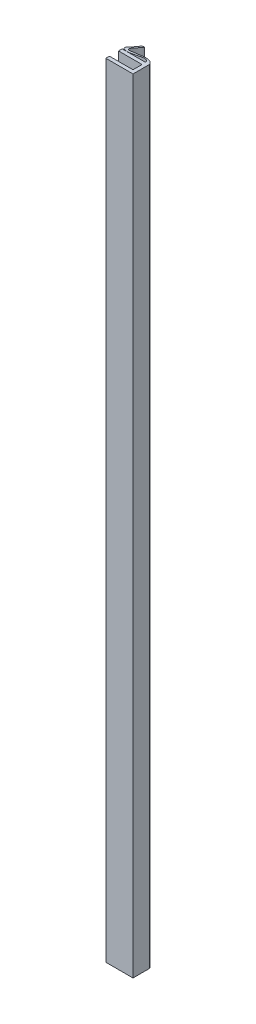
ISO-10303-21;
HEADER;
FILE_DESCRIPTION(('STEP AP214'),'2;1');
FILE_NAME('part.step','',(''),(''),'','','');
FILE_SCHEMA(('AUTOMOTIVE_DESIGN { 1 0 10303 214 1 1 1 1 }'));
ENDSEC;
DATA;
#1=APPLICATION_CONTEXT('core data for automotive mechanical design processes');
#2=APPLICATION_PROTOCOL_DEFINITION('international standard','automotive_design',2000,#1);
#3=PRODUCT_CONTEXT('',#1,'mechanical');
#4=PRODUCT('Part','Part','',(#3));
#5=PRODUCT_RELATED_PRODUCT_CATEGORY('part','',(#4));
#6=PRODUCT_DEFINITION_FORMATION('','',#4);
#7=PRODUCT_DEFINITION_CONTEXT('part definition',#1,'design');
#8=PRODUCT_DEFINITION('design','',#6,#7);
#9=PRODUCT_DEFINITION_SHAPE('','',#8);
#10=(LENGTH_UNIT() NAMED_UNIT(*) SI_UNIT(.MILLI.,.METRE.));
#11=(NAMED_UNIT(*) PLANE_ANGLE_UNIT() SI_UNIT($,.RADIAN.));
#12=(NAMED_UNIT(*) SI_UNIT($,.STERADIAN.) SOLID_ANGLE_UNIT());
#13=UNCERTAINTY_MEASURE_WITH_UNIT(LENGTH_MEASURE(1.E-05),#10,'distance_accuracy_value','');
#14=(GEOMETRIC_REPRESENTATION_CONTEXT(3) GLOBAL_UNCERTAINTY_ASSIGNED_CONTEXT((#13)) GLOBAL_UNIT_ASSIGNED_CONTEXT((#10,
#11,#12)) REPRESENTATION_CONTEXT('',''));
#15=CARTESIAN_POINT('',(0.,0.,0.));
#16=DIRECTION('',(0.,0.,1.));
#17=DIRECTION('',(1.,0.,0.));
#18=AXIS2_PLACEMENT_3D('',#15,#16,#17);
#19=CARTESIAN_POINT('',(-138.333333333333,81.4583333333333,9.));
#20=DIRECTION('',(1.,0.,0.));
#21=DIRECTION('',(0.,1.,0.));
#22=AXIS2_PLACEMENT_3D('',#19,#20,#21);
#23=PLANE('',#22);
#24=DIRECTION('',(0.,0.,-1.));
#25=VECTOR('',#24,1.);
#26=CARTESIAN_POINT('',(-138.333333333333,-350.541666666667,9.));
#27=LINE('',#26,#25);
#28=CARTESIAN_POINT('',(-138.333333333333,-350.541666666667,2.00000000000005));
#29=VERTEX_POINT('',#28);
#30=CARTESIAN_POINT('',(-138.333333333333,-350.541666666667,0.));
#31=VERTEX_POINT('',#30);
#32=EDGE_CURVE('E41',#29,#31,#27,.T.);
#33=ORIENTED_EDGE('',*,*,#32,.F.);
#34=DIRECTION('',(0.,-1.,0.));
#35=VECTOR('',#34,1.);
#36=CARTESIAN_POINT('',(-138.333333333333,81.4583333333333,2.));
#37=LINE('',#36,#35);
#38=CARTESIAN_POINT('',(-138.333333333333,81.4583333333333,2.));
#39=VERTEX_POINT('',#38);
#40=EDGE_CURVE('E180',#39,#29,#37,.T.);
#41=ORIENTED_EDGE('',*,*,#40,.F.);
#42=DIRECTION('',(0.,0.,-1.));
#43=VECTOR('',#42,1.);
#44=CARTESIAN_POINT('',(-138.333333333333,81.4583333333333,9.));
#45=LINE('',#44,#43);
#46=CARTESIAN_POINT('',(-138.333333333333,81.4583333333333,0.));
#47=VERTEX_POINT('',#46);
#48=EDGE_CURVE('E151',#39,#47,#45,.T.);
#49=ORIENTED_EDGE('',*,*,#48,.T.);
#50=DIRECTION('',(0.,-1.,0.));
#51=VECTOR('',#50,1.);
#52=CARTESIAN_POINT('',(-138.333333333333,81.4583333333333,0.));
#53=LINE('',#52,#51);
#54=EDGE_CURVE('E156',#47,#31,#53,.T.);
#55=ORIENTED_EDGE('',*,*,#54,.T.);
#56=EDGE_LOOP('',(#33,#41,#49,#55));
#57=FACE_BOUND('',#56,.T.);
#58=ADVANCED_FACE('F33',(#57),#23,.F.);
#59=CARTESIAN_POINT('',(-138.333333333333,81.4583333333333,9.));
#60=VERTEX_POINT('',#59);
#61=CARTESIAN_POINT('',(-138.333333333333,81.4583333333333,7.));
#62=VERTEX_POINT('',#61);
#63=EDGE_CURVE('E146',#60,#62,#45,.T.);
#64=ORIENTED_EDGE('',*,*,#63,.T.);
#65=DIRECTION('',(0.,1.,0.));
#66=VECTOR('',#65,1.);
#67=CARTESIAN_POINT('',(-138.333333333333,81.4583333333333,7.));
#68=LINE('',#67,#66);
#69=CARTESIAN_POINT('',(-138.333333333333,-350.541666666667,7.00000000000005));
#70=VERTEX_POINT('',#69);
#71=EDGE_CURVE('E177',#70,#62,#68,.T.);
#72=ORIENTED_EDGE('',*,*,#71,.F.);
#73=CARTESIAN_POINT('',(-138.333333333333,-350.541666666667,9.));
#74=VERTEX_POINT('',#73);
#75=EDGE_CURVE('E11',#74,#70,#27,.T.);
#76=ORIENTED_EDGE('',*,*,#75,.F.);
#77=DIRECTION('',(0.,-1.,0.));
#78=VECTOR('',#77,1.);
#79=CARTESIAN_POINT('',(-138.333333333333,81.4583333333333,9.));
#80=LINE('',#79,#78);
#81=EDGE_CURVE('E152',#60,#74,#80,.T.);
#82=ORIENTED_EDGE('',*,*,#81,.F.);
#83=EDGE_LOOP('',(#64,#72,#76,#82));
#84=FACE_BOUND('',#83,.T.);
#85=ADVANCED_FACE('F35',(#84),#23,.F.);
#86=CARTESIAN_POINT('',(-138.333333333333,-350.541666666667,9.));
#87=DIRECTION('',(0.,1.,0.));
#88=DIRECTION('',(0.,0.,1.));
#89=AXIS2_PLACEMENT_3D('',#86,#87,#88);
#90=PLANE('',#89);
#91=DIRECTION('',(0.,0.,1.));
#92=VECTOR('',#91,1.);
#93=CARTESIAN_POINT('',(-125.333333333333,-350.541666666667,2.00000000000005));
#94=LINE('',#93,#92);
#95=CARTESIAN_POINT('',(-125.333333333333,-350.541666666667,2.00000000000005));
#96=VERTEX_POINT('',#95);
#97=CARTESIAN_POINT('',(-125.333333333333,-350.541666666667,7.00000000000005));
#98=VERTEX_POINT('',#97);
#99=EDGE_CURVE('E184',#96,#98,#94,.T.);
#100=ORIENTED_EDGE('',*,*,#99,.F.);
#101=DIRECTION('',(-1.,0.,0.));
#102=VECTOR('',#101,1.);
#103=CARTESIAN_POINT('',(-125.333333333333,-350.541666666667,2.00000000000005));
#104=LINE('',#103,#102);
#105=EDGE_CURVE('E167',#96,#29,#104,.T.);
#106=ORIENTED_EDGE('',*,*,#105,.T.);
#107=ORIENTED_EDGE('',*,*,#32,.T.);
#108=DIRECTION('',(1.,0.,0.));
#109=VECTOR('',#108,1.);
#110=CARTESIAN_POINT('',(-138.333333333333,-350.541666666667,0.));
#111=LINE('',#110,#109);
#112=CARTESIAN_POINT('',(-125.536673175502,-350.541666666667,0.));
#113=VERTEX_POINT('',#112);
#114=EDGE_CURVE('E130',#31,#113,#111,.T.);
#115=ORIENTED_EDGE('',*,*,#114,.T.);
#116=CARTESIAN_POINT('',(-125.536673175502,-350.541666666667,0.));
#117=CARTESIAN_POINT('',(-125.569623367716,-350.541666666667,-2.13980410945582));
#118=CARTESIAN_POINT('',(-131.4288623102,-350.541666666667,-1.1507862053045));
#119=CARTESIAN_POINT('',(-135.48997674558,-350.541666666667,0.580457240441385));
#120=CARTESIAN_POINT('',(-139.065634242665,-350.541666666667,-0.920144904964965));
#121=CARTESIAN_POINT('',(-137.519705785349,-350.541666666667,-2.65070515652292));
#122=B_SPLINE_CURVE_WITH_KNOTS('',3,(#116,#117,#118,#119,#120,#121),.UNSPECIFIED.,.F.,.F.,(4,1,
1,4),(0.,0.357335721129013,0.796302077981611,1.),.UNSPECIFIED.);
#123=CARTESIAN_POINT('',(-137.519705785349,-350.541666666667,-2.65070515652292));
#124=VERTEX_POINT('',#123);
#125=EDGE_CURVE('E141',#113,#124,#122,.T.);
#126=ORIENTED_EDGE('',*,*,#125,.T.);
#127=DIRECTION('',(0.673329668846748,0.,-0.73934238147879));
#128=VECTOR('',#127,1.);
#129=CARTESIAN_POINT('',(-134.627901385812,-350.541666666667,-5.82601979130903));
#130=LINE('',#129,#128);
#131=CARTESIAN_POINT('',(-134.627901385812,-350.541666666667,-5.82601979130903));
#132=VERTEX_POINT('',#131);
#133=EDGE_CURVE('E140',#124,#132,#130,.T.);
#134=ORIENTED_EDGE('',*,*,#133,.T.);
#135=CARTESIAN_POINT('',(-134.627901385812,-350.541666666667,-5.82601979130903));
#136=CARTESIAN_POINT('',(-135.233825794297,-350.541666666667,-6.53256866262647));
#137=CARTESIAN_POINT('',(-131.83861977318,-350.541666666667,-7.60641833242904));
#138=CARTESIAN_POINT('',(-135.120294758792,-350.541666666667,-4.37629385199125));
#139=CARTESIAN_POINT('',(-139.792499922728,-350.541666666667,2.01631581950832));
#140=CARTESIAN_POINT('',(-125.020509014504,-350.541666666667,-5.13508252677906));
#141=CARTESIAN_POINT('',(-123.333333333333,-350.541666666667,0.));
#142=B_SPLINE_CURVE_WITH_KNOTS('',3,(#135,#136,#137,#138,#139,#140,#141),.UNSPECIFIED.,.F.,.F.,
(4,1,1,1,4),(0.,0.0942371700968534,0.174570448969891,0.375284615244663,1.),.UNSPECIFIED.);
#143=CARTESIAN_POINT('',(-123.333333333333,-350.541666666667,0.));
#144=VERTEX_POINT('',#143);
#145=EDGE_CURVE('E122',#132,#144,#142,.T.);
#146=ORIENTED_EDGE('',*,*,#145,.T.);
#147=DIRECTION('',(0.,0.,-1.));
#148=VECTOR('',#147,1.);
#149=CARTESIAN_POINT('',(-123.333333333333,-350.541666666667,9.));
#150=LINE('',#149,#148);
#151=CARTESIAN_POINT('',(-123.333333333333,-350.541666666667,9.));
#152=VERTEX_POINT('',#151);
#153=EDGE_CURVE('E136',#152,#144,#150,.T.);
#154=ORIENTED_EDGE('',*,*,#153,.F.);
#155=DIRECTION('',(1.,0.,0.));
#156=VECTOR('',#155,1.);
#157=CARTESIAN_POINT('',(-138.333333333333,-350.541666666667,9.));
#158=LINE('',#157,#156);
#159=EDGE_CURVE('E163',#74,#152,#158,.T.);
#160=ORIENTED_EDGE('',*,*,#159,.F.);
#161=ORIENTED_EDGE('',*,*,#75,.T.);
#162=DIRECTION('',(-1.,0.,0.));
#163=VECTOR('',#162,1.);
#164=CARTESIAN_POINT('',(-125.333333333333,-350.541666666667,7.00000000000005));
#165=LINE('',#164,#163);
#166=EDGE_CURVE('E170',#98,#70,#165,.T.);
#167=ORIENTED_EDGE('',*,*,#166,.F.);
#168=EDGE_LOOP('',(#100,#106,#107,#115,#126,#134,#146,#154,#160,#161,#167));
#169=FACE_BOUND('',#168,.T.);
#170=ADVANCED_FACE('F135',(#169),#90,.F.);
#171=CARTESIAN_POINT('',(-123.333333333333,81.4583333333333,9.));
#172=DIRECTION('',(-1.,0.,0.));
#173=DIRECTION('',(0.,-1.,0.));
#174=AXIS2_PLACEMENT_3D('',#171,#172,#173);
#175=PLANE('',#174);
#176=DIRECTION('',(0.,1.,0.));
#177=VECTOR('',#176,1.);
#178=CARTESIAN_POINT('',(-123.333333333333,81.4583333333333,0.));
#179=LINE('',#178,#177);
#180=CARTESIAN_POINT('',(-123.333333333333,81.4583333333333,0.));
#181=VERTEX_POINT('',#180);
#182=EDGE_CURVE('E118',#144,#181,#179,.T.);
#183=ORIENTED_EDGE('',*,*,#182,.T.);
#184=DIRECTION('',(0.,0.,-1.));
#185=VECTOR('',#184,1.);
#186=CARTESIAN_POINT('',(-123.333333333333,81.4583333333333,9.));
#187=LINE('',#186,#185);
#188=CARTESIAN_POINT('',(-123.333333333333,81.4583333333333,9.));
#189=VERTEX_POINT('',#188);
#190=EDGE_CURVE('E145',#189,#181,#187,.T.);
#191=ORIENTED_EDGE('',*,*,#190,.F.);
#192=DIRECTION('',(0.,1.,0.));
#193=VECTOR('',#192,1.);
#194=CARTESIAN_POINT('',(-123.333333333333,81.4583333333333,9.));
#195=LINE('',#194,#193);
#196=EDGE_CURVE('E144',#152,#189,#195,.T.);
#197=ORIENTED_EDGE('',*,*,#196,.F.);
#198=ORIENTED_EDGE('',*,*,#153,.T.);
#199=EDGE_LOOP('',(#183,#191,#197,#198));
#200=FACE_BOUND('',#199,.T.);
#201=ADVANCED_FACE('F143',(#200),#175,.F.);
#202=CARTESIAN_POINT('',(-138.333333333333,81.4583333333333,9.));
#203=DIRECTION('',(0.,-1.,0.));
#204=DIRECTION('',(0.,0.,-1.));
#205=AXIS2_PLACEMENT_3D('',#202,#203,#204);
#206=PLANE('',#205);
#207=ORIENTED_EDGE('',*,*,#48,.F.);
#208=DIRECTION('',(-1.,0.,0.));
#209=VECTOR('',#208,1.);
#210=CARTESIAN_POINT('',(-125.333333333333,81.4583333333333,2.));
#211=LINE('',#210,#209);
#212=CARTESIAN_POINT('',(-125.333333333333,81.4583333333333,2.));
#213=VERTEX_POINT('',#212);
#214=EDGE_CURVE('E159',#213,#39,#211,.T.);
#215=ORIENTED_EDGE('',*,*,#214,.F.);
#216=DIRECTION('',(0.,0.,-1.));
#217=VECTOR('',#216,1.);
#218=CARTESIAN_POINT('',(-125.333333333333,81.4583333333333,2.));
#219=LINE('',#218,#217);
#220=CARTESIAN_POINT('',(-125.333333333333,81.4583333333333,7.00000000000005));
#221=VERTEX_POINT('',#220);
#222=EDGE_CURVE('E171',#221,#213,#219,.T.);
#223=ORIENTED_EDGE('',*,*,#222,.F.);
#224=DIRECTION('',(-1.,0.,0.));
#225=VECTOR('',#224,1.);
#226=CARTESIAN_POINT('',(-125.333333333333,81.4583333333333,7.));
#227=LINE('',#226,#225);
#228=EDGE_CURVE('E173',#221,#62,#227,.T.);
#229=ORIENTED_EDGE('',*,*,#228,.T.);
#230=ORIENTED_EDGE('',*,*,#63,.F.);
#231=DIRECTION('',(-1.,0.,0.));
#232=VECTOR('',#231,1.);
#233=CARTESIAN_POINT('',(-138.333333333333,81.4583333333333,9.));
#234=LINE('',#233,#232);
#235=EDGE_CURVE('E160',#189,#60,#234,.T.);
#236=ORIENTED_EDGE('',*,*,#235,.F.);
#237=ORIENTED_EDGE('',*,*,#190,.T.);
#238=CARTESIAN_POINT('',(-134.627901385812,81.4583333333333,-5.82601979130903));
#239=CARTESIAN_POINT('',(-135.233825794297,81.4583333333333,-6.53256866262647));
#240=CARTESIAN_POINT('',(-131.83861977318,81.4583333333333,-7.60641833242904));
#241=CARTESIAN_POINT('',(-135.120294758792,81.4583333333333,-4.37629385199125));
#242=CARTESIAN_POINT('',(-139.792499922728,81.4583333333333,2.01631581950832));
#243=CARTESIAN_POINT('',(-125.020509014504,81.4583333333333,-5.13508252677906));
#244=CARTESIAN_POINT('',(-123.333333333333,81.4583333333333,0.));
#245=B_SPLINE_CURVE_WITH_KNOTS('',3,(#238,#239,#240,#241,#242,#243,#244),.UNSPECIFIED.,.F.,.F.,
(4,1,1,1,4),(0.,0.0942371700968534,0.174570448969891,0.375284615244663,1.),.UNSPECIFIED.);
#246=CARTESIAN_POINT('',(-134.627901385812,81.4583333333333,-5.82601979130903));
#247=VERTEX_POINT('',#246);
#248=EDGE_CURVE('E124',#181,#247,#245,.F.);
#249=ORIENTED_EDGE('',*,*,#248,.T.);
#250=DIRECTION('',(-0.673329668846748,0.,0.73934238147879));
#251=VECTOR('',#250,1.);
#252=CARTESIAN_POINT('',(-134.627901385812,81.4583333333333,-5.82601979130903));
#253=LINE('',#252,#251);
#254=CARTESIAN_POINT('',(-137.519705785349,81.4583333333333,-2.65070515652292));
#255=VERTEX_POINT('',#254);
#256=EDGE_CURVE('E267',#247,#255,#253,.T.);
#257=ORIENTED_EDGE('',*,*,#256,.T.);
#258=CARTESIAN_POINT('',(-125.536673175502,81.4583333333333,0.));
#259=CARTESIAN_POINT('',(-125.569623367716,81.4583333333333,-2.13980410945582));
#260=CARTESIAN_POINT('',(-131.4288623102,81.4583333333333,-1.1507862053045));
#261=CARTESIAN_POINT('',(-135.48997674558,81.4583333333333,0.580457240441385));
#262=CARTESIAN_POINT('',(-139.065634242665,81.4583333333333,-0.920144904964965));
#263=CARTESIAN_POINT('',(-137.519705785349,81.4583333333333,-2.65070515652292));
#264=B_SPLINE_CURVE_WITH_KNOTS('',3,(#258,#259,#260,#261,#262,#263),.UNSPECIFIED.,.F.,.F.,(4,1,
1,4),(0.,0.357335721129013,0.796302077981611,1.),.UNSPECIFIED.);
#265=CARTESIAN_POINT('',(-125.536673175502,81.4583333333333,0.));
#266=VERTEX_POINT('',#265);
#267=EDGE_CURVE('E193',#255,#266,#264,.F.);
#268=ORIENTED_EDGE('',*,*,#267,.T.);
#269=DIRECTION('',(-1.,0.,0.));
#270=VECTOR('',#269,1.);
#271=CARTESIAN_POINT('',(-138.333333333333,81.4583333333333,0.));
#272=LINE('',#271,#270);
#273=EDGE_CURVE('E129',#266,#47,#272,.T.);
#274=ORIENTED_EDGE('',*,*,#273,.T.);
#275=EDGE_LOOP('',(#207,#215,#223,#229,#230,#236,#237,#249,#257,#268,#274));
#276=FACE_BOUND('',#275,.T.);
#277=ADVANCED_FACE('F240',(#276),#206,.F.);
#278=CARTESIAN_POINT('',(0.,0.,9.));
#279=DIRECTION('',(0.,0.,1.));
#280=DIRECTION('',(1.,0.,0.));
#281=AXIS2_PLACEMENT_3D('',#278,#279,#280);
#282=PLANE('',#281);
#283=ORIENTED_EDGE('',*,*,#81,.T.);
#284=ORIENTED_EDGE('',*,*,#159,.T.);
#285=ORIENTED_EDGE('',*,*,#196,.T.);
#286=ORIENTED_EDGE('',*,*,#235,.T.);
#287=EDGE_LOOP('',(#283,#284,#285,#286));
#288=FACE_BOUND('',#287,.T.);
#289=ADVANCED_FACE('F237',(#288),#282,.T.);
#290=CARTESIAN_POINT('',(0.,0.,0.));
#291=DIRECTION('',(0.,0.,1.));
#292=DIRECTION('',(1.,0.,0.));
#293=AXIS2_PLACEMENT_3D('',#290,#291,#292);
#294=PLANE('',#293);
#295=ORIENTED_EDGE('',*,*,#273,.F.);
#296=DIRECTION('',(0.,-1.,0.));
#297=VECTOR('',#296,1.);
#298=CARTESIAN_POINT('',(-125.536673175502,98.0791964734644,0.));
#299=LINE('',#298,#297);
#300=EDGE_CURVE('E48',#266,#113,#299,.T.);
#301=ORIENTED_EDGE('',*,*,#300,.T.);
#302=ORIENTED_EDGE('',*,*,#114,.F.);
#303=ORIENTED_EDGE('',*,*,#54,.F.);
#304=EDGE_LOOP('',(#295,#301,#302,#303));
#305=FACE_BOUND('',#304,.T.);
#306=ADVANCED_FACE('F235',(#305),#294,.F.);
#307=CARTESIAN_POINT('',(-125.333333333333,81.4583333333333,2.));
#308=DIRECTION('',(0.,0.,-1.));
#309=DIRECTION('',(0.,1.,0.));
#310=AXIS2_PLACEMENT_3D('',#307,#308,#309);
#311=PLANE('',#310);
#312=ORIENTED_EDGE('',*,*,#40,.T.);
#313=ORIENTED_EDGE('',*,*,#105,.F.);
#314=DIRECTION('',(0.,-1.,0.));
#315=VECTOR('',#314,1.);
#316=CARTESIAN_POINT('',(-125.333333333333,81.4583333333333,2.));
#317=LINE('',#316,#315);
#318=EDGE_CURVE('E179',#213,#96,#317,.T.);
#319=ORIENTED_EDGE('',*,*,#318,.F.);
#320=ORIENTED_EDGE('',*,*,#214,.T.);
#321=EDGE_LOOP('',(#312,#313,#319,#320));
#322=FACE_BOUND('',#321,.T.);
#323=ADVANCED_FACE('F231',(#322),#311,.F.);
#324=CARTESIAN_POINT('',(-125.333333333333,81.4583333333333,7.));
#325=DIRECTION('',(0.,0.,1.));
#326=DIRECTION('',(0.,-1.,0.));
#327=AXIS2_PLACEMENT_3D('',#324,#325,#326);
#328=PLANE('',#327);
#329=ORIENTED_EDGE('',*,*,#71,.T.);
#330=ORIENTED_EDGE('',*,*,#228,.F.);
#331=DIRECTION('',(0.,1.,0.));
#332=VECTOR('',#331,1.);
#333=CARTESIAN_POINT('',(-125.333333333333,81.4583333333333,7.));
#334=LINE('',#333,#332);
#335=EDGE_CURVE('E56',#98,#221,#334,.T.);
#336=ORIENTED_EDGE('',*,*,#335,.F.);
#337=ORIENTED_EDGE('',*,*,#166,.T.);
#338=EDGE_LOOP('',(#329,#330,#336,#337));
#339=FACE_BOUND('',#338,.T.);
#340=ADVANCED_FACE('F228',(#339),#328,.F.);
#341=CARTESIAN_POINT('',(-125.333333333333,0.,0.));
#342=DIRECTION('',(-1.,0.,0.));
#343=DIRECTION('',(0.,-1.,0.));
#344=AXIS2_PLACEMENT_3D('',#341,#342,#343);
#345=PLANE('',#344);
#346=ORIENTED_EDGE('',*,*,#318,.T.);
#347=ORIENTED_EDGE('',*,*,#99,.T.);
#348=ORIENTED_EDGE('',*,*,#335,.T.);
#349=ORIENTED_EDGE('',*,*,#222,.T.);
#350=EDGE_LOOP('',(#346,#347,#348,#349));
#351=FACE_BOUND('',#350,.T.);
#352=ADVANCED_FACE('F225',(#351),#345,.T.);
#353=CARTESIAN_POINT('',(-134.627901385812,98.0791964734644,-5.82601979130903));
#354=CARTESIAN_POINT('',(-135.233825794297,98.0791964734644,-6.53256866262647));
#355=CARTESIAN_POINT('',(-131.83861977318,98.0791964734644,-7.60641833242904));
#356=CARTESIAN_POINT('',(-135.120294758792,98.0791964734644,-4.37629385199125));
#357=CARTESIAN_POINT('',(-139.792499922728,98.0791964734644,2.01631581950832));
#358=CARTESIAN_POINT('',(-125.020509014504,98.0791964734644,-5.13508252677906));
#359=CARTESIAN_POINT('',(-123.333333333333,98.0791964734644,0.));
#360=B_SPLINE_CURVE_WITH_KNOTS('',3,(#353,#354,#355,#356,#357,#358,#359),.UNSPECIFIED.,.F.,.F.,
(4,1,1,1,4),(0.,0.0942371700968534,0.174570448969891,0.375284615244663,1.),.UNSPECIFIED.);
#361=DIRECTION('',(0.,-1.,0.));
#362=VECTOR('',#361,1.);
#363=SURFACE_OF_LINEAR_EXTRUSION('',#360,#362);
#364=ORIENTED_EDGE('',*,*,#248,.F.);
#365=ORIENTED_EDGE('',*,*,#182,.F.);
#366=ORIENTED_EDGE('',*,*,#145,.F.);
#367=DIRECTION('',(0.,-1.,0.));
#368=VECTOR('',#367,1.);
#369=CARTESIAN_POINT('',(-134.627901385812,98.0791964734644,-5.82601979130903));
#370=LINE('',#369,#368);
#371=EDGE_CURVE('E191',#247,#132,#370,.T.);
#372=ORIENTED_EDGE('',*,*,#371,.F.);
#373=EDGE_LOOP('',(#364,#365,#366,#372));
#374=FACE_BOUND('',#373,.T.);
#375=ADVANCED_FACE('F120',(#374),#363,.T.);
#376=CARTESIAN_POINT('',(-134.627901385812,98.0791964734644,-5.82601979130903));
#377=DIRECTION('',(-0.73934238147879,0.,-0.673329668846748));
#378=DIRECTION('',(-0.673329668846748,0.,0.73934238147879));
#379=AXIS2_PLACEMENT_3D('',#376,#377,#378);
#380=PLANE('',#379);
#381=ORIENTED_EDGE('',*,*,#256,.F.);
#382=ORIENTED_EDGE('',*,*,#371,.T.);
#383=ORIENTED_EDGE('',*,*,#133,.F.);
#384=DIRECTION('',(0.,-1.,0.));
#385=VECTOR('',#384,1.);
#386=CARTESIAN_POINT('',(-137.519705785349,98.0791964734644,-2.65070515652292));
#387=LINE('',#386,#385);
#388=EDGE_CURVE('E189',#255,#124,#387,.T.);
#389=ORIENTED_EDGE('',*,*,#388,.F.);
#390=EDGE_LOOP('',(#381,#382,#383,#389));
#391=FACE_BOUND('',#390,.T.);
#392=ADVANCED_FACE('F222',(#391),#380,.T.);
#393=CARTESIAN_POINT('',(-125.536673175502,98.0791964734644,0.));
#394=CARTESIAN_POINT('',(-125.569623367716,98.0791964734644,-2.13980410945582));
#395=CARTESIAN_POINT('',(-131.4288623102,98.0791964734644,-1.1507862053045));
#396=CARTESIAN_POINT('',(-135.48997674558,98.0791964734644,0.580457240441385));
#397=CARTESIAN_POINT('',(-139.065634242665,98.0791964734644,-0.920144904964965));
#398=CARTESIAN_POINT('',(-137.519705785349,98.0791964734644,-2.65070515652292));
#399=B_SPLINE_CURVE_WITH_KNOTS('',3,(#393,#394,#395,#396,#397,#398),.UNSPECIFIED.,.F.,.F.,(4,1,
1,4),(0.,0.357335721129013,0.796302077981611,1.),.UNSPECIFIED.);
#400=DIRECTION('',(0.,-1.,0.));
#401=VECTOR('',#400,1.);
#402=SURFACE_OF_LINEAR_EXTRUSION('',#399,#401);
#403=ORIENTED_EDGE('',*,*,#267,.F.);
#404=ORIENTED_EDGE('',*,*,#388,.T.);
#405=ORIENTED_EDGE('',*,*,#125,.F.);
#406=ORIENTED_EDGE('',*,*,#300,.F.);
#407=EDGE_LOOP('',(#403,#404,#405,#406));
#408=FACE_BOUND('',#407,.T.);
#409=ADVANCED_FACE('F218',(#408),#402,.T.);
#410=CLOSED_SHELL('',(#58,#85,#170,#201,#277,#289,#306,#323,#340,#352,#375,#392,#409));
#411=MANIFOLD_SOLID_BREP('B2',#410);
#412=ADVANCED_BREP_SHAPE_REPRESENTATION('',(#18,#411),#14);
#413=SHAPE_DEFINITION_REPRESENTATION(#9,#412);
ENDSEC;
END-ISO-10303-21;
